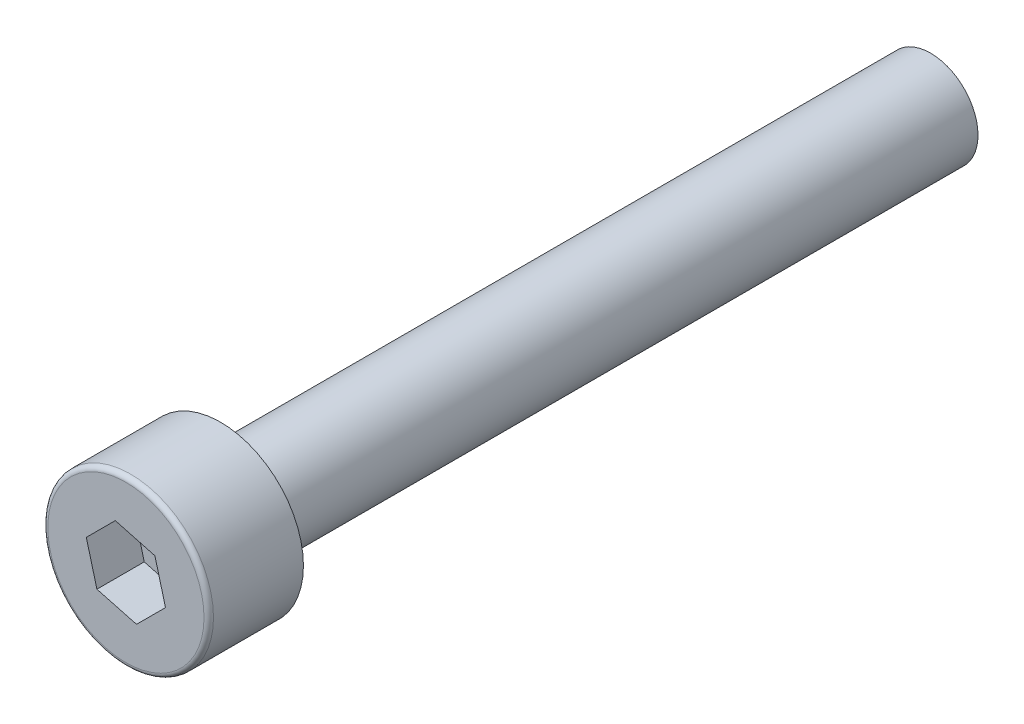
ISO-10303-21;
HEADER;
FILE_DESCRIPTION(('STEP AP214'),'2;1');
FILE_NAME('part.step','',(''),(''),'','','');
FILE_SCHEMA(('AUTOMOTIVE_DESIGN { 1 0 10303 214 1 1 1 1 }'));
ENDSEC;
DATA;
#1=APPLICATION_CONTEXT('core data for automotive mechanical design processes');
#2=APPLICATION_PROTOCOL_DEFINITION('international standard','automotive_design',2000,#1);
#3=PRODUCT_CONTEXT('',#1,'mechanical');
#4=PRODUCT('Part','Part','',(#3));
#5=PRODUCT_RELATED_PRODUCT_CATEGORY('part','',(#4));
#6=PRODUCT_DEFINITION_FORMATION('','',#4);
#7=PRODUCT_DEFINITION_CONTEXT('part definition',#1,'design');
#8=PRODUCT_DEFINITION('design','',#6,#7);
#9=PRODUCT_DEFINITION_SHAPE('','',#8);
#10=(LENGTH_UNIT() NAMED_UNIT(*) SI_UNIT(.MILLI.,.METRE.));
#11=(NAMED_UNIT(*) PLANE_ANGLE_UNIT() SI_UNIT($,.RADIAN.));
#12=(NAMED_UNIT(*) SI_UNIT($,.STERADIAN.) SOLID_ANGLE_UNIT());
#13=UNCERTAINTY_MEASURE_WITH_UNIT(LENGTH_MEASURE(1.E-05),#10,'distance_accuracy_value','');
#14=(GEOMETRIC_REPRESENTATION_CONTEXT(3) GLOBAL_UNCERTAINTY_ASSIGNED_CONTEXT((#13)) GLOBAL_UNIT_ASSIGNED_CONTEXT((#10,
#11,#12)) REPRESENTATION_CONTEXT('',''));
#15=CARTESIAN_POINT('',(0.,0.,0.));
#16=DIRECTION('',(0.,0.,1.));
#17=DIRECTION('',(1.,0.,0.));
#18=AXIS2_PLACEMENT_3D('',#15,#16,#17);
#19=CARTESIAN_POINT('',(0.,0.,0.));
#20=DIRECTION('',(0.,0.,1.));
#21=DIRECTION('',(1.,0.,0.));
#22=AXIS2_PLACEMENT_3D('',#19,#20,#21);
#23=PLANE('',#22);
#24=CARTESIAN_POINT('',(0.,0.,0.));
#25=DIRECTION('',(0.,0.,1.));
#26=DIRECTION('',(1.,0.,0.));
#27=AXIS2_PLACEMENT_3D('',#24,#25,#26);
#28=CIRCLE('',#27,3.5);
#29=CARTESIAN_POINT('',(3.5,0.,0.));
#30=VERTEX_POINT('',#29);
#31=EDGE_CURVE('E137',#30,#30,#28,.T.);
#32=ORIENTED_EDGE('',*,*,#31,.F.);
#33=EDGE_LOOP('',(#32));
#34=FACE_BOUND('',#33,.T.);
#35=CARTESIAN_POINT('',(0.,0.,0.));
#36=DIRECTION('',(0.,0.,1.));
#37=DIRECTION('',(1.,0.,0.));
#38=AXIS2_PLACEMENT_3D('',#35,#36,#37);
#39=CIRCLE('',#38,2.);
#40=CARTESIAN_POINT('',(2.,0.,0.));
#41=VERTEX_POINT('',#40);
#42=EDGE_CURVE('E145',#41,#41,#39,.F.);
#43=ORIENTED_EDGE('',*,*,#42,.F.);
#44=EDGE_LOOP('',(#43));
#45=FACE_BOUND('',#44,.T.);
#46=ADVANCED_FACE('F34',(#34,#45),#23,.F.);
#47=CARTESIAN_POINT('',(0.,0.,4.));
#48=DIRECTION('',(0.,0.,-1.));
#49=DIRECTION('',(-1.,0.,0.));
#50=AXIS2_PLACEMENT_3D('',#47,#48,#49);
#51=CYLINDRICAL_SURFACE('',#50,3.5);
#52=CARTESIAN_POINT('',(0.,0.,3.8));
#53=DIRECTION('',(0.,0.,1.));
#54=DIRECTION('',(1.,0.,0.));
#55=AXIS2_PLACEMENT_3D('',#52,#53,#54);
#56=CIRCLE('',#55,3.5);
#57=CARTESIAN_POINT('',(3.5,0.,3.8));
#58=VERTEX_POINT('',#57);
#59=EDGE_CURVE('E11',#58,#58,#56,.F.);
#60=ORIENTED_EDGE('',*,*,#59,.T.);
#61=EDGE_LOOP('',(#60));
#62=FACE_BOUND('',#61,.T.);
#63=ORIENTED_EDGE('',*,*,#31,.T.);
#64=EDGE_LOOP('',(#63));
#65=FACE_BOUND('',#64,.T.);
#66=ADVANCED_FACE('F164',(#62,#65),#51,.T.);
#67=CARTESIAN_POINT('',(0.,0.,4.));
#68=DIRECTION('',(0.,0.,1.));
#69=DIRECTION('',(1.,0.,0.));
#70=AXIS2_PLACEMENT_3D('',#67,#68,#69);
#71=PLANE('',#70);
#72=CARTESIAN_POINT('',(0.,0.,4.));
#73=DIRECTION('',(0.,0.,1.));
#74=DIRECTION('',(1.,0.,0.));
#75=AXIS2_PLACEMENT_3D('',#72,#73,#74);
#76=CIRCLE('',#75,3.3);
#77=CARTESIAN_POINT('',(3.3,0.,4.));
#78=VERTEX_POINT('',#77);
#79=EDGE_CURVE('E42',#78,#78,#76,.T.);
#80=ORIENTED_EDGE('',*,*,#79,.T.);
#81=EDGE_LOOP('',(#80));
#82=FACE_BOUND('',#81,.T.);
#83=DIRECTION('',(0.258819045102521,-0.965925826289068,0.));
#84=VECTOR('',#83,1.);
#85=CARTESIAN_POINT('',(-1.67303260747562,0.448287736084027,4.));
#86=LINE('',#85,#84);
#87=CARTESIAN_POINT('',(-1.67303260747562,0.448287736084027,4.));
#88=VERTEX_POINT('',#87);
#89=CARTESIAN_POINT('',(-1.22474487139159,-1.22474487139159,4.));
#90=VERTEX_POINT('',#89);
#91=EDGE_CURVE('E49',#88,#90,#86,.T.);
#92=ORIENTED_EDGE('',*,*,#91,.F.);
#93=DIRECTION('',(-0.707106781186547,-0.707106781186548,0.));
#94=VECTOR('',#93,1.);
#95=CARTESIAN_POINT('',(-0.448287736084027,1.67303260747562,4.));
#96=LINE('',#95,#94);
#97=CARTESIAN_POINT('',(-0.448287736084027,1.67303260747562,4.));
#98=VERTEX_POINT('',#97);
#99=EDGE_CURVE('E133',#98,#88,#96,.T.);
#100=ORIENTED_EDGE('',*,*,#99,.F.);
#101=DIRECTION('',(-0.965925826289068,0.258819045102521,0.));
#102=VECTOR('',#101,1.);
#103=CARTESIAN_POINT('',(1.22474487139159,1.22474487139159,4.));
#104=LINE('',#103,#102);
#105=CARTESIAN_POINT('',(1.22474487139159,1.22474487139159,4.));
#106=VERTEX_POINT('',#105);
#107=EDGE_CURVE('E131',#106,#98,#104,.T.);
#108=ORIENTED_EDGE('',*,*,#107,.F.);
#109=DIRECTION('',(-0.258819045102521,0.965925826289068,0.));
#110=VECTOR('',#109,1.);
#111=CARTESIAN_POINT('',(1.67303260747562,-0.448287736084027,4.));
#112=LINE('',#111,#110);
#113=CARTESIAN_POINT('',(1.67303260747562,-0.448287736084027,4.));
#114=VERTEX_POINT('',#113);
#115=EDGE_CURVE('E97',#114,#106,#112,.T.);
#116=ORIENTED_EDGE('',*,*,#115,.F.);
#117=DIRECTION('',(0.707106781186547,0.707106781186548,0.));
#118=VECTOR('',#117,1.);
#119=CARTESIAN_POINT('',(0.448287736084026,-1.67303260747562,4.));
#120=LINE('',#119,#118);
#121=CARTESIAN_POINT('',(0.448287736084026,-1.67303260747562,4.));
#122=VERTEX_POINT('',#121);
#123=EDGE_CURVE('E127',#122,#114,#120,.T.);
#124=ORIENTED_EDGE('',*,*,#123,.F.);
#125=DIRECTION('',(0.965925826289068,-0.258819045102521,0.));
#126=VECTOR('',#125,1.);
#127=CARTESIAN_POINT('',(-1.22474487139159,-1.22474487139159,4.));
#128=LINE('',#127,#126);
#129=EDGE_CURVE('E123',#90,#122,#128,.T.);
#130=ORIENTED_EDGE('',*,*,#129,.F.);
#131=EDGE_LOOP('',(#92,#100,#108,#116,#124,#130));
#132=FACE_BOUND('',#131,.T.);
#133=ADVANCED_FACE('F150',(#82,#132),#71,.T.);
#134=CARTESIAN_POINT('',(-1.67303260747562,0.448287736084027,2.));
#135=DIRECTION('',(-0.965925826289068,-0.258819045102521,0.));
#136=DIRECTION('',(0.258819045102521,-0.965925826289068,0.));
#137=AXIS2_PLACEMENT_3D('',#134,#135,#136);
#138=PLANE('',#137);
#139=ORIENTED_EDGE('',*,*,#91,.T.);
#140=DIRECTION('',(0.,0.,1.));
#141=VECTOR('',#140,1.);
#142=CARTESIAN_POINT('',(-1.22474487139159,-1.22474487139159,2.));
#143=LINE('',#142,#141);
#144=CARTESIAN_POINT('',(-1.22474487139159,-1.22474487139159,2.));
#145=VERTEX_POINT('',#144);
#146=EDGE_CURVE('E79',#145,#90,#143,.T.);
#147=ORIENTED_EDGE('',*,*,#146,.F.);
#148=DIRECTION('',(0.258819045102521,-0.965925826289068,0.));
#149=VECTOR('',#148,1.);
#150=CARTESIAN_POINT('',(-1.67303260747562,0.448287736084027,2.));
#151=LINE('',#150,#149);
#152=CARTESIAN_POINT('',(-1.67303260747562,0.448287736084027,2.));
#153=VERTEX_POINT('',#152);
#154=EDGE_CURVE('E135',#153,#145,#151,.T.);
#155=ORIENTED_EDGE('',*,*,#154,.F.);
#156=DIRECTION('',(0.,0.,1.));
#157=VECTOR('',#156,1.);
#158=CARTESIAN_POINT('',(-1.67303260747562,0.448287736084027,2.));
#159=LINE('',#158,#157);
#160=EDGE_CURVE('E57',#153,#88,#159,.T.);
#161=ORIENTED_EDGE('',*,*,#160,.T.);
#162=EDGE_LOOP('',(#139,#147,#155,#161));
#163=FACE_BOUND('',#162,.T.);
#164=ADVANCED_FACE('F176',(#163),#138,.F.);
#165=CARTESIAN_POINT('',(-0.448287736084027,1.67303260747562,2.));
#166=DIRECTION('',(-0.707106781186548,0.707106781186547,0.));
#167=DIRECTION('',(-0.707106781186547,-0.707106781186548,0.));
#168=AXIS2_PLACEMENT_3D('',#165,#166,#167);
#169=PLANE('',#168);
#170=ORIENTED_EDGE('',*,*,#99,.T.);
#171=ORIENTED_EDGE('',*,*,#160,.F.);
#172=DIRECTION('',(-0.707106781186547,-0.707106781186548,0.));
#173=VECTOR('',#172,1.);
#174=CARTESIAN_POINT('',(-0.448287736084027,1.67303260747562,2.));
#175=LINE('',#174,#173);
#176=CARTESIAN_POINT('',(-0.448287736084027,1.67303260747562,2.));
#177=VERTEX_POINT('',#176);
#178=EDGE_CURVE('E109',#177,#153,#175,.T.);
#179=ORIENTED_EDGE('',*,*,#178,.F.);
#180=DIRECTION('',(0.,0.,1.));
#181=VECTOR('',#180,1.);
#182=CARTESIAN_POINT('',(-0.448287736084027,1.67303260747562,2.));
#183=LINE('',#182,#181);
#184=EDGE_CURVE('E101',#177,#98,#183,.T.);
#185=ORIENTED_EDGE('',*,*,#184,.T.);
#186=EDGE_LOOP('',(#170,#171,#179,#185));
#187=FACE_BOUND('',#186,.T.);
#188=ADVANCED_FACE('F179',(#187),#169,.F.);
#189=CARTESIAN_POINT('',(1.22474487139159,1.22474487139159,2.));
#190=DIRECTION('',(0.258819045102521,0.965925826289068,0.));
#191=DIRECTION('',(-0.965925826289068,0.258819045102521,0.));
#192=AXIS2_PLACEMENT_3D('',#189,#190,#191);
#193=PLANE('',#192);
#194=ORIENTED_EDGE('',*,*,#107,.T.);
#195=ORIENTED_EDGE('',*,*,#184,.F.);
#196=DIRECTION('',(-0.965925826289068,0.258819045102521,0.));
#197=VECTOR('',#196,1.);
#198=CARTESIAN_POINT('',(1.22474487139159,1.22474487139159,2.));
#199=LINE('',#198,#197);
#200=CARTESIAN_POINT('',(1.22474487139159,1.22474487139159,2.));
#201=VERTEX_POINT('',#200);
#202=EDGE_CURVE('E105',#201,#177,#199,.T.);
#203=ORIENTED_EDGE('',*,*,#202,.F.);
#204=DIRECTION('',(0.,0.,1.));
#205=VECTOR('',#204,1.);
#206=CARTESIAN_POINT('',(1.22474487139159,1.22474487139159,2.));
#207=LINE('',#206,#205);
#208=EDGE_CURVE('E90',#201,#106,#207,.T.);
#209=ORIENTED_EDGE('',*,*,#208,.T.);
#210=EDGE_LOOP('',(#194,#195,#203,#209));
#211=FACE_BOUND('',#210,.T.);
#212=ADVANCED_FACE('F106',(#211),#193,.F.);
#213=CARTESIAN_POINT('',(1.67303260747562,-0.448287736084027,2.));
#214=DIRECTION('',(0.965925826289068,0.258819045102521,0.));
#215=DIRECTION('',(-0.258819045102521,0.965925826289068,0.));
#216=AXIS2_PLACEMENT_3D('',#213,#214,#215);
#217=PLANE('',#216);
#218=ORIENTED_EDGE('',*,*,#115,.T.);
#219=ORIENTED_EDGE('',*,*,#208,.F.);
#220=DIRECTION('',(-0.258819045102521,0.965925826289068,0.));
#221=VECTOR('',#220,1.);
#222=CARTESIAN_POINT('',(1.67303260747562,-0.448287736084027,2.));
#223=LINE('',#222,#221);
#224=CARTESIAN_POINT('',(1.67303260747562,-0.448287736084027,2.));
#225=VERTEX_POINT('',#224);
#226=EDGE_CURVE('E94',#225,#201,#223,.T.);
#227=ORIENTED_EDGE('',*,*,#226,.F.);
#228=DIRECTION('',(0.,0.,1.));
#229=VECTOR('',#228,1.);
#230=CARTESIAN_POINT('',(1.67303260747562,-0.448287736084027,2.));
#231=LINE('',#230,#229);
#232=EDGE_CURVE('E102',#225,#114,#231,.T.);
#233=ORIENTED_EDGE('',*,*,#232,.T.);
#234=EDGE_LOOP('',(#218,#219,#227,#233));
#235=FACE_BOUND('',#234,.T.);
#236=ADVANCED_FACE('F92',(#235),#217,.F.);
#237=CARTESIAN_POINT('',(0.448287736084026,-1.67303260747562,2.));
#238=DIRECTION('',(0.707106781186548,-0.707106781186547,0.));
#239=DIRECTION('',(0.707106781186547,0.707106781186548,0.));
#240=AXIS2_PLACEMENT_3D('',#237,#238,#239);
#241=PLANE('',#240);
#242=ORIENTED_EDGE('',*,*,#123,.T.);
#243=ORIENTED_EDGE('',*,*,#232,.F.);
#244=DIRECTION('',(0.707106781186547,0.707106781186548,0.));
#245=VECTOR('',#244,1.);
#246=CARTESIAN_POINT('',(0.448287736084026,-1.67303260747562,2.));
#247=LINE('',#246,#245);
#248=CARTESIAN_POINT('',(0.448287736084026,-1.67303260747562,2.));
#249=VERTEX_POINT('',#248);
#250=EDGE_CURVE('E115',#249,#225,#247,.T.);
#251=ORIENTED_EDGE('',*,*,#250,.F.);
#252=DIRECTION('',(0.,0.,1.));
#253=VECTOR('',#252,1.);
#254=CARTESIAN_POINT('',(0.448287736084026,-1.67303260747562,2.));
#255=LINE('',#254,#253);
#256=EDGE_CURVE('E140',#249,#122,#255,.T.);
#257=ORIENTED_EDGE('',*,*,#256,.T.);
#258=EDGE_LOOP('',(#242,#243,#251,#257));
#259=FACE_BOUND('',#258,.T.);
#260=ADVANCED_FACE('F183',(#259),#241,.F.);
#261=CARTESIAN_POINT('',(-1.22474487139159,-1.22474487139159,2.));
#262=DIRECTION('',(-0.258819045102521,-0.965925826289068,0.));
#263=DIRECTION('',(0.965925826289068,-0.258819045102521,0.));
#264=AXIS2_PLACEMENT_3D('',#261,#262,#263);
#265=PLANE('',#264);
#266=ORIENTED_EDGE('',*,*,#129,.T.);
#267=ORIENTED_EDGE('',*,*,#256,.F.);
#268=DIRECTION('',(0.965925826289068,-0.258819045102521,0.));
#269=VECTOR('',#268,1.);
#270=CARTESIAN_POINT('',(-1.22474487139159,-1.22474487139159,2.));
#271=LINE('',#270,#269);
#272=EDGE_CURVE('E117',#145,#249,#271,.T.);
#273=ORIENTED_EDGE('',*,*,#272,.F.);
#274=ORIENTED_EDGE('',*,*,#146,.T.);
#275=EDGE_LOOP('',(#266,#267,#273,#274));
#276=FACE_BOUND('',#275,.T.);
#277=ADVANCED_FACE('F180',(#276),#265,.F.);
#278=CARTESIAN_POINT('',(0.,0.,2.));
#279=DIRECTION('',(0.,0.,1.));
#280=DIRECTION('',(1.,0.,0.));
#281=AXIS2_PLACEMENT_3D('',#278,#279,#280);
#282=PLANE('',#281);
#283=ORIENTED_EDGE('',*,*,#154,.T.);
#284=ORIENTED_EDGE('',*,*,#272,.T.);
#285=ORIENTED_EDGE('',*,*,#250,.T.);
#286=ORIENTED_EDGE('',*,*,#226,.T.);
#287=ORIENTED_EDGE('',*,*,#202,.T.);
#288=ORIENTED_EDGE('',*,*,#178,.T.);
#289=EDGE_LOOP('',(#283,#284,#285,#286,#287,#288));
#290=FACE_BOUND('',#289,.T.);
#291=ADVANCED_FACE('F112',(#290),#282,.T.);
#292=CARTESIAN_POINT('',(0.,0.,-30.));
#293=DIRECTION('',(0.,0.,1.));
#294=DIRECTION('',(1.,0.,0.));
#295=AXIS2_PLACEMENT_3D('',#292,#293,#294);
#296=CYLINDRICAL_SURFACE('',#295,2.);
#297=CARTESIAN_POINT('',(0.,0.,-30.));
#298=DIRECTION('',(0.,0.,-1.));
#299=DIRECTION('',(-1.,0.,0.));
#300=AXIS2_PLACEMENT_3D('',#297,#298,#299);
#301=CIRCLE('',#300,2.);
#302=CARTESIAN_POINT('',(-2.,0.,-30.));
#303=VERTEX_POINT('',#302);
#304=EDGE_CURVE('E124',#303,#303,#301,.T.);
#305=ORIENTED_EDGE('',*,*,#304,.F.);
#306=EDGE_LOOP('',(#305));
#307=FACE_BOUND('',#306,.T.);
#308=ORIENTED_EDGE('',*,*,#42,.T.);
#309=EDGE_LOOP('',(#308));
#310=FACE_BOUND('',#309,.T.);
#311=ADVANCED_FACE('F159',(#307,#310),#296,.T.);
#312=CARTESIAN_POINT('',(0.,0.,-30.));
#313=DIRECTION('',(0.,0.,-1.));
#314=DIRECTION('',(-1.,0.,0.));
#315=AXIS2_PLACEMENT_3D('',#312,#313,#314);
#316=PLANE('',#315);
#317=ORIENTED_EDGE('',*,*,#304,.T.);
#318=EDGE_LOOP('',(#317));
#319=FACE_BOUND('',#318,.T.);
#320=ADVANCED_FACE('F154',(#319),#316,.T.);
#321=CARTESIAN_POINT('',(0.,0.,3.8));
#322=DIRECTION('',(0.,0.,1.));
#323=DIRECTION('',(1.,0.,0.));
#324=AXIS2_PLACEMENT_3D('',#321,#322,#323);
#325=TOROIDAL_SURFACE('',#324,3.3,0.2);
#326=ORIENTED_EDGE('',*,*,#59,.F.);
#327=EDGE_LOOP('',(#326));
#328=FACE_BOUND('',#327,.T.);
#329=ORIENTED_EDGE('',*,*,#79,.F.);
#330=EDGE_LOOP('',(#329));
#331=FACE_BOUND('',#330,.T.);
#332=ADVANCED_FACE('F36',(#328,#331),#325,.T.);
#333=CLOSED_SHELL('',(#46,#66,#133,#164,#188,#212,#236,#260,#277,#291,#311,#320,#332));
#334=MANIFOLD_SOLID_BREP('B2',#333);
#335=ADVANCED_BREP_SHAPE_REPRESENTATION('',(#18,#334),#14);
#336=SHAPE_DEFINITION_REPRESENTATION(#9,#335);
ENDSEC;
END-ISO-10303-21;
